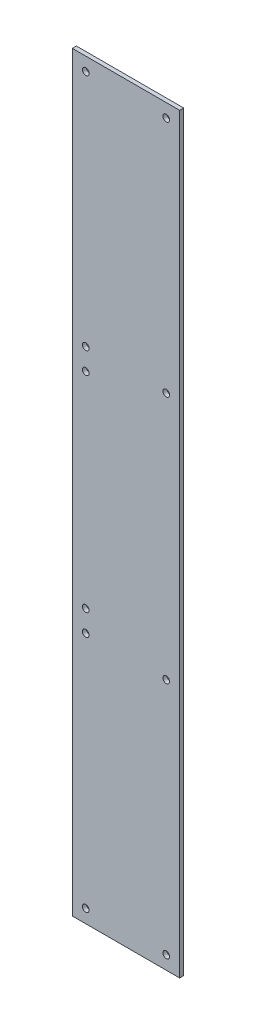
ISO-10303-21;
HEADER;
FILE_DESCRIPTION(('STEP AP214'),'2;1');
FILE_NAME('part.step','',(''),(''),'','','');
FILE_SCHEMA(('AUTOMOTIVE_DESIGN { 1 0 10303 214 1 1 1 1 }'));
ENDSEC;
DATA;
#1=APPLICATION_CONTEXT('core data for automotive mechanical design processes');
#2=APPLICATION_PROTOCOL_DEFINITION('international standard','automotive_design',2000,#1);
#3=PRODUCT_CONTEXT('',#1,'mechanical');
#4=PRODUCT('Part','Part','',(#3));
#5=PRODUCT_RELATED_PRODUCT_CATEGORY('part','',(#4));
#6=PRODUCT_DEFINITION_FORMATION('','',#4);
#7=PRODUCT_DEFINITION_CONTEXT('part definition',#1,'design');
#8=PRODUCT_DEFINITION('design','',#6,#7);
#9=PRODUCT_DEFINITION_SHAPE('','',#8);
#10=(LENGTH_UNIT() NAMED_UNIT(*) SI_UNIT(.MILLI.,.METRE.));
#11=(NAMED_UNIT(*) PLANE_ANGLE_UNIT() SI_UNIT($,.RADIAN.));
#12=(NAMED_UNIT(*) SI_UNIT($,.STERADIAN.) SOLID_ANGLE_UNIT());
#13=UNCERTAINTY_MEASURE_WITH_UNIT(LENGTH_MEASURE(1.E-05),#10,'distance_accuracy_value','');
#14=(GEOMETRIC_REPRESENTATION_CONTEXT(3) GLOBAL_UNCERTAINTY_ASSIGNED_CONTEXT((#13)) GLOBAL_UNIT_ASSIGNED_CONTEXT((#10,
#11,#12)) REPRESENTATION_CONTEXT('',''));
#15=CARTESIAN_POINT('',(0.,0.,0.));
#16=DIRECTION('',(0.,0.,1.));
#17=DIRECTION('',(1.,0.,0.));
#18=AXIS2_PLACEMENT_3D('',#15,#16,#17);
#19=CARTESIAN_POINT('',(-34.3589743589744,84.102564102564,3.));
#20=DIRECTION('',(1.,0.,0.));
#21=DIRECTION('',(0.,1.,0.));
#22=AXIS2_PLACEMENT_3D('',#19,#20,#21);
#23=PLANE('',#22);
#24=DIRECTION('',(0.,-1.,0.));
#25=VECTOR('',#24,1.);
#26=CARTESIAN_POINT('',(-34.3589743589744,84.102564102564,0.));
#27=LINE('',#26,#25);
#28=CARTESIAN_POINT('',(-34.3589743589744,84.102564102564,0.));
#29=VERTEX_POINT('',#28);
#30=CARTESIAN_POINT('',(-34.3589743589743,-475.897435897436,0.));
#31=VERTEX_POINT('',#30);
#32=EDGE_CURVE('E96',#29,#31,#27,.T.);
#33=ORIENTED_EDGE('',*,*,#32,.T.);
#34=DIRECTION('',(0.,0.,-1.));
#35=VECTOR('',#34,1.);
#36=CARTESIAN_POINT('',(-34.3589743589743,-475.897435897436,3.));
#37=LINE('',#36,#35);
#38=CARTESIAN_POINT('',(-34.3589743589743,-475.897435897436,3.));
#39=VERTEX_POINT('',#38);
#40=EDGE_CURVE('E11',#39,#31,#37,.T.);
#41=ORIENTED_EDGE('',*,*,#40,.F.);
#42=DIRECTION('',(0.,-1.,0.));
#43=VECTOR('',#42,1.);
#44=CARTESIAN_POINT('',(-34.3589743589744,84.102564102564,3.));
#45=LINE('',#44,#43);
#46=CARTESIAN_POINT('',(-34.3589743589744,84.102564102564,3.));
#47=VERTEX_POINT('',#46);
#48=EDGE_CURVE('E84',#47,#39,#45,.T.);
#49=ORIENTED_EDGE('',*,*,#48,.F.);
#50=DIRECTION('',(0.,0.,-1.));
#51=VECTOR('',#50,1.);
#52=CARTESIAN_POINT('',(-34.3589743589744,84.102564102564,3.));
#53=LINE('',#52,#51);
#54=EDGE_CURVE('E92',#47,#29,#53,.T.);
#55=ORIENTED_EDGE('',*,*,#54,.T.);
#56=EDGE_LOOP('',(#33,#41,#49,#55));
#57=FACE_BOUND('',#56,.T.);
#58=ADVANCED_FACE('F33',(#57),#23,.F.);
#59=CARTESIAN_POINT('',(-34.3589743589743,-475.897435897436,3.));
#60=DIRECTION('',(0.,1.,0.));
#61=DIRECTION('',(0.,0.,1.));
#62=AXIS2_PLACEMENT_3D('',#59,#60,#61);
#63=PLANE('',#62);
#64=DIRECTION('',(1.,0.,0.));
#65=VECTOR('',#64,1.);
#66=CARTESIAN_POINT('',(-34.3589743589743,-475.897435897436,0.));
#67=LINE('',#66,#65);
#68=CARTESIAN_POINT('',(45.6410256410257,-475.897435897436,0.));
#69=VERTEX_POINT('',#68);
#70=EDGE_CURVE('E88',#31,#69,#67,.T.);
#71=ORIENTED_EDGE('',*,*,#70,.T.);
#72=DIRECTION('',(0.,0.,-1.));
#73=VECTOR('',#72,1.);
#74=CARTESIAN_POINT('',(45.6410256410257,-475.897435897436,3.));
#75=LINE('',#74,#73);
#76=CARTESIAN_POINT('',(45.6410256410257,-475.897435897436,3.));
#77=VERTEX_POINT('',#76);
#78=EDGE_CURVE('E41',#77,#69,#75,.T.);
#79=ORIENTED_EDGE('',*,*,#78,.F.);
#80=DIRECTION('',(1.,0.,0.));
#81=VECTOR('',#80,1.);
#82=CARTESIAN_POINT('',(-34.3589743589743,-475.897435897436,3.));
#83=LINE('',#82,#81);
#84=EDGE_CURVE('E79',#39,#77,#83,.T.);
#85=ORIENTED_EDGE('',*,*,#84,.F.);
#86=ORIENTED_EDGE('',*,*,#40,.T.);
#87=EDGE_LOOP('',(#71,#79,#85,#86));
#88=FACE_BOUND('',#87,.T.);
#89=ADVANCED_FACE('F87',(#88),#63,.F.);
#90=CARTESIAN_POINT('',(45.6410256410256,84.102564102564,3.));
#91=DIRECTION('',(-1.,0.,0.));
#92=DIRECTION('',(0.,-1.,0.));
#93=AXIS2_PLACEMENT_3D('',#90,#91,#92);
#94=PLANE('',#93);
#95=DIRECTION('',(0.,1.,0.));
#96=VECTOR('',#95,1.);
#97=CARTESIAN_POINT('',(45.6410256410256,84.102564102564,0.));
#98=LINE('',#97,#96);
#99=CARTESIAN_POINT('',(45.6410256410256,84.102564102564,0.));
#100=VERTEX_POINT('',#99);
#101=EDGE_CURVE('E66',#69,#100,#98,.T.);
#102=ORIENTED_EDGE('',*,*,#101,.T.);
#103=DIRECTION('',(0.,0.,-1.));
#104=VECTOR('',#103,1.);
#105=CARTESIAN_POINT('',(45.6410256410256,84.102564102564,3.));
#106=LINE('',#105,#104);
#107=CARTESIAN_POINT('',(45.6410256410256,84.102564102564,3.));
#108=VERTEX_POINT('',#107);
#109=EDGE_CURVE('E89',#108,#100,#106,.T.);
#110=ORIENTED_EDGE('',*,*,#109,.F.);
#111=DIRECTION('',(0.,1.,0.));
#112=VECTOR('',#111,1.);
#113=CARTESIAN_POINT('',(45.6410256410256,84.102564102564,3.));
#114=LINE('',#113,#112);
#115=EDGE_CURVE('E82',#77,#108,#114,.T.);
#116=ORIENTED_EDGE('',*,*,#115,.F.);
#117=ORIENTED_EDGE('',*,*,#78,.T.);
#118=EDGE_LOOP('',(#102,#110,#116,#117));
#119=FACE_BOUND('',#118,.T.);
#120=ADVANCED_FACE('F90',(#119),#94,.F.);
#121=CARTESIAN_POINT('',(-34.3589743589744,84.102564102564,3.));
#122=DIRECTION('',(0.,-1.,0.));
#123=DIRECTION('',(0.,0.,-1.));
#124=AXIS2_PLACEMENT_3D('',#121,#122,#123);
#125=PLANE('',#124);
#126=DIRECTION('',(-1.,0.,0.));
#127=VECTOR('',#126,1.);
#128=CARTESIAN_POINT('',(-34.3589743589744,84.102564102564,0.));
#129=LINE('',#128,#127);
#130=EDGE_CURVE('E72',#100,#29,#129,.T.);
#131=ORIENTED_EDGE('',*,*,#130,.T.);
#132=ORIENTED_EDGE('',*,*,#54,.F.);
#133=DIRECTION('',(-1.,0.,0.));
#134=VECTOR('',#133,1.);
#135=CARTESIAN_POINT('',(-34.3589743589744,84.102564102564,3.));
#136=LINE('',#135,#134);
#137=EDGE_CURVE('E49',#108,#47,#136,.T.);
#138=ORIENTED_EDGE('',*,*,#137,.F.);
#139=ORIENTED_EDGE('',*,*,#109,.T.);
#140=EDGE_LOOP('',(#131,#132,#138,#139));
#141=FACE_BOUND('',#140,.T.);
#142=ADVANCED_FACE('F104',(#141),#125,.F.);
#143=CARTESIAN_POINT('',(0.,0.,3.));
#144=DIRECTION('',(0.,0.,1.));
#145=DIRECTION('',(1.,0.,0.));
#146=AXIS2_PLACEMENT_3D('',#143,#144,#145);
#147=PLANE('',#146);
#148=CARTESIAN_POINT('',(-24.3589743589744,-103.397435897436,3.));
#149=DIRECTION('',(0.,0.,1.));
#150=DIRECTION('',(1.,0.,0.));
#151=AXIS2_PLACEMENT_3D('',#148,#149,#150);
#152=CIRCLE('',#151,2.5);
#153=CARTESIAN_POINT('',(-21.8589743589744,-103.397435897436,3.));
#154=VERTEX_POINT('',#153);
#155=EDGE_CURVE('E99',#154,#154,#152,.T.);
#156=ORIENTED_EDGE('',*,*,#155,.F.);
#157=EDGE_LOOP('',(#156));
#158=FACE_BOUND('',#157,.T.);
#159=CARTESIAN_POINT('',(-24.3589743589744,-288.397435897436,3.));
#160=DIRECTION('',(0.,0.,1.));
#161=DIRECTION('',(1.,0.,0.));
#162=AXIS2_PLACEMENT_3D('',#159,#160,#161);
#163=CIRCLE('',#162,2.5);
#164=CARTESIAN_POINT('',(-21.8589743589744,-288.397435897436,3.));
#165=VERTEX_POINT('',#164);
#166=EDGE_CURVE('E112',#165,#165,#163,.T.);
#167=ORIENTED_EDGE('',*,*,#166,.F.);
#168=EDGE_LOOP('',(#167));
#169=FACE_BOUND('',#168,.T.);
#170=CARTESIAN_POINT('',(-24.3589743589744,-272.397435897436,3.));
#171=DIRECTION('',(0.,0.,1.));
#172=DIRECTION('',(1.,0.,0.));
#173=AXIS2_PLACEMENT_3D('',#170,#171,#172);
#174=CIRCLE('',#173,2.5);
#175=CARTESIAN_POINT('',(-21.8589743589744,-272.397435897436,3.));
#176=VERTEX_POINT('',#175);
#177=EDGE_CURVE('E115',#176,#176,#174,.T.);
#178=ORIENTED_EDGE('',*,*,#177,.F.);
#179=EDGE_LOOP('',(#178));
#180=FACE_BOUND('',#179,.T.);
#181=CARTESIAN_POINT('',(-24.3589743589744,-119.397435897436,3.));
#182=DIRECTION('',(0.,0.,1.));
#183=DIRECTION('',(1.,0.,0.));
#184=AXIS2_PLACEMENT_3D('',#181,#182,#183);
#185=CIRCLE('',#184,2.5);
#186=CARTESIAN_POINT('',(-21.8589743589744,-119.397435897436,3.));
#187=VERTEX_POINT('',#186);
#188=EDGE_CURVE('E118',#187,#187,#185,.T.);
#189=ORIENTED_EDGE('',*,*,#188,.F.);
#190=EDGE_LOOP('',(#189));
#191=FACE_BOUND('',#190,.T.);
#192=CARTESIAN_POINT('',(35.6410256410257,74.102564102564,3.));
#193=DIRECTION('',(0.,0.,1.));
#194=DIRECTION('',(1.,0.,0.));
#195=AXIS2_PLACEMENT_3D('',#192,#193,#194);
#196=CIRCLE('',#195,2.5);
#197=CARTESIAN_POINT('',(38.1410256410257,74.102564102564,3.));
#198=VERTEX_POINT('',#197);
#199=EDGE_CURVE('E121',#198,#198,#196,.T.);
#200=ORIENTED_EDGE('',*,*,#199,.F.);
#201=EDGE_LOOP('',(#200));
#202=FACE_BOUND('',#201,.T.);
#203=CARTESIAN_POINT('',(-24.3589743589744,-465.897435897436,3.));
#204=DIRECTION('',(0.,0.,1.));
#205=DIRECTION('',(1.,0.,0.));
#206=AXIS2_PLACEMENT_3D('',#203,#204,#205);
#207=CIRCLE('',#206,2.5);
#208=CARTESIAN_POINT('',(-21.8589743589744,-465.897435897436,3.));
#209=VERTEX_POINT('',#208);
#210=EDGE_CURVE('E124',#209,#209,#207,.T.);
#211=ORIENTED_EDGE('',*,*,#210,.F.);
#212=EDGE_LOOP('',(#211));
#213=FACE_BOUND('',#212,.T.);
#214=CARTESIAN_POINT('',(35.6410256410257,-465.897435897436,3.));
#215=DIRECTION('',(0.,0.,1.));
#216=DIRECTION('',(1.,0.,0.));
#217=AXIS2_PLACEMENT_3D('',#214,#215,#216);
#218=CIRCLE('',#217,2.5);
#219=CARTESIAN_POINT('',(38.1410256410257,-465.897435897436,3.));
#220=VERTEX_POINT('',#219);
#221=EDGE_CURVE('E127',#220,#220,#218,.T.);
#222=ORIENTED_EDGE('',*,*,#221,.F.);
#223=EDGE_LOOP('',(#222));
#224=FACE_BOUND('',#223,.T.);
#225=CARTESIAN_POINT('',(35.6410256410257,-103.397435897436,3.));
#226=DIRECTION('',(0.,0.,1.));
#227=DIRECTION('',(1.,0.,0.));
#228=AXIS2_PLACEMENT_3D('',#225,#226,#227);
#229=CIRCLE('',#228,2.5);
#230=CARTESIAN_POINT('',(38.1410256410257,-103.397435897436,3.));
#231=VERTEX_POINT('',#230);
#232=EDGE_CURVE('E130',#231,#231,#229,.T.);
#233=ORIENTED_EDGE('',*,*,#232,.F.);
#234=EDGE_LOOP('',(#233));
#235=FACE_BOUND('',#234,.T.);
#236=CARTESIAN_POINT('',(35.6410256410257,-288.397435897436,3.));
#237=DIRECTION('',(0.,0.,1.));
#238=DIRECTION('',(1.,0.,0.));
#239=AXIS2_PLACEMENT_3D('',#236,#237,#238);
#240=CIRCLE('',#239,2.5);
#241=CARTESIAN_POINT('',(38.1410256410257,-288.397435897436,3.));
#242=VERTEX_POINT('',#241);
#243=EDGE_CURVE('E133',#242,#242,#240,.T.);
#244=ORIENTED_EDGE('',*,*,#243,.F.);
#245=EDGE_LOOP('',(#244));
#246=FACE_BOUND('',#245,.T.);
#247=CARTESIAN_POINT('',(-24.3589743589744,74.102564102564,3.));
#248=DIRECTION('',(0.,0.,1.));
#249=DIRECTION('',(1.,0.,0.));
#250=AXIS2_PLACEMENT_3D('',#247,#248,#249);
#251=CIRCLE('',#250,2.5);
#252=CARTESIAN_POINT('',(-21.8589743589744,74.102564102564,3.));
#253=VERTEX_POINT('',#252);
#254=EDGE_CURVE('E136',#253,#253,#251,.T.);
#255=ORIENTED_EDGE('',*,*,#254,.F.);
#256=EDGE_LOOP('',(#255));
#257=FACE_BOUND('',#256,.T.);
#258=ORIENTED_EDGE('',*,*,#48,.T.);
#259=ORIENTED_EDGE('',*,*,#84,.T.);
#260=ORIENTED_EDGE('',*,*,#115,.T.);
#261=ORIENTED_EDGE('',*,*,#137,.T.);
#262=EDGE_LOOP('',(#258,#259,#260,#261));
#263=FACE_BOUND('',#262,.T.);
#264=ADVANCED_FACE('F80',(#158,#169,#180,#191,#202,#213,#224,#235,#246,#257,#263),#147,.T.);
#265=CARTESIAN_POINT('',(0.,0.,0.));
#266=DIRECTION('',(0.,0.,1.));
#267=DIRECTION('',(1.,0.,0.));
#268=AXIS2_PLACEMENT_3D('',#265,#266,#267);
#269=PLANE('',#268);
#270=CARTESIAN_POINT('',(-24.3589743589744,-103.397435897436,0.));
#271=DIRECTION('',(0.,0.,1.));
#272=DIRECTION('',(1.,0.,0.));
#273=AXIS2_PLACEMENT_3D('',#270,#271,#272);
#274=CIRCLE('',#273,2.5);
#275=CARTESIAN_POINT('',(-21.8589743589744,-103.397435897436,0.));
#276=VERTEX_POINT('',#275);
#277=EDGE_CURVE('E152',#276,#276,#274,.T.);
#278=ORIENTED_EDGE('',*,*,#277,.T.);
#279=EDGE_LOOP('',(#278));
#280=FACE_BOUND('',#279,.T.);
#281=CARTESIAN_POINT('',(-24.3589743589744,-288.397435897436,0.));
#282=DIRECTION('',(0.,0.,1.));
#283=DIRECTION('',(1.,0.,0.));
#284=AXIS2_PLACEMENT_3D('',#281,#282,#283);
#285=CIRCLE('',#284,2.5);
#286=CARTESIAN_POINT('',(-21.8589743589744,-288.397435897436,0.));
#287=VERTEX_POINT('',#286);
#288=EDGE_CURVE('E155',#287,#287,#285,.T.);
#289=ORIENTED_EDGE('',*,*,#288,.T.);
#290=EDGE_LOOP('',(#289));
#291=FACE_BOUND('',#290,.T.);
#292=CARTESIAN_POINT('',(-24.3589743589744,-272.397435897436,0.));
#293=DIRECTION('',(0.,0.,1.));
#294=DIRECTION('',(1.,0.,0.));
#295=AXIS2_PLACEMENT_3D('',#292,#293,#294);
#296=CIRCLE('',#295,2.5);
#297=CARTESIAN_POINT('',(-21.8589743589744,-272.397435897436,0.));
#298=VERTEX_POINT('',#297);
#299=EDGE_CURVE('E158',#298,#298,#296,.T.);
#300=ORIENTED_EDGE('',*,*,#299,.T.);
#301=EDGE_LOOP('',(#300));
#302=FACE_BOUND('',#301,.T.);
#303=CARTESIAN_POINT('',(-24.3589743589744,-119.397435897436,0.));
#304=DIRECTION('',(0.,0.,1.));
#305=DIRECTION('',(1.,0.,0.));
#306=AXIS2_PLACEMENT_3D('',#303,#304,#305);
#307=CIRCLE('',#306,2.5);
#308=CARTESIAN_POINT('',(-21.8589743589744,-119.397435897436,0.));
#309=VERTEX_POINT('',#308);
#310=EDGE_CURVE('E161',#309,#309,#307,.T.);
#311=ORIENTED_EDGE('',*,*,#310,.T.);
#312=EDGE_LOOP('',(#311));
#313=FACE_BOUND('',#312,.T.);
#314=CARTESIAN_POINT('',(35.6410256410257,74.102564102564,0.));
#315=DIRECTION('',(0.,0.,1.));
#316=DIRECTION('',(1.,0.,0.));
#317=AXIS2_PLACEMENT_3D('',#314,#315,#316);
#318=CIRCLE('',#317,2.5);
#319=CARTESIAN_POINT('',(38.1410256410257,74.102564102564,0.));
#320=VERTEX_POINT('',#319);
#321=EDGE_CURVE('E142',#320,#320,#318,.T.);
#322=ORIENTED_EDGE('',*,*,#321,.T.);
#323=EDGE_LOOP('',(#322));
#324=FACE_BOUND('',#323,.T.);
#325=CARTESIAN_POINT('',(-24.3589743589744,-465.897435897436,0.));
#326=DIRECTION('',(0.,0.,1.));
#327=DIRECTION('',(1.,0.,0.));
#328=AXIS2_PLACEMENT_3D('',#325,#326,#327);
#329=CIRCLE('',#328,2.5);
#330=CARTESIAN_POINT('',(-21.8589743589744,-465.897435897436,0.));
#331=VERTEX_POINT('',#330);
#332=EDGE_CURVE('E143',#331,#331,#329,.T.);
#333=ORIENTED_EDGE('',*,*,#332,.T.);
#334=EDGE_LOOP('',(#333));
#335=FACE_BOUND('',#334,.T.);
#336=CARTESIAN_POINT('',(35.6410256410257,-465.897435897436,0.));
#337=DIRECTION('',(0.,0.,1.));
#338=DIRECTION('',(1.,0.,0.));
#339=AXIS2_PLACEMENT_3D('',#336,#337,#338);
#340=CIRCLE('',#339,2.5);
#341=CARTESIAN_POINT('',(38.1410256410257,-465.897435897436,0.));
#342=VERTEX_POINT('',#341);
#343=EDGE_CURVE('E146',#342,#342,#340,.T.);
#344=ORIENTED_EDGE('',*,*,#343,.T.);
#345=EDGE_LOOP('',(#344));
#346=FACE_BOUND('',#345,.T.);
#347=CARTESIAN_POINT('',(35.6410256410257,-103.397435897436,0.));
#348=DIRECTION('',(0.,0.,1.));
#349=DIRECTION('',(1.,0.,0.));
#350=AXIS2_PLACEMENT_3D('',#347,#348,#349);
#351=CIRCLE('',#350,2.5);
#352=CARTESIAN_POINT('',(38.1410256410257,-103.397435897436,0.));
#353=VERTEX_POINT('',#352);
#354=EDGE_CURVE('E149',#353,#353,#351,.T.);
#355=ORIENTED_EDGE('',*,*,#354,.T.);
#356=EDGE_LOOP('',(#355));
#357=FACE_BOUND('',#356,.T.);
#358=CARTESIAN_POINT('',(35.6410256410257,-288.397435897436,0.));
#359=DIRECTION('',(0.,0.,1.));
#360=DIRECTION('',(1.,0.,0.));
#361=AXIS2_PLACEMENT_3D('',#358,#359,#360);
#362=CIRCLE('',#361,2.5);
#363=CARTESIAN_POINT('',(38.1410256410257,-288.397435897436,0.));
#364=VERTEX_POINT('',#363);
#365=EDGE_CURVE('E164',#364,#364,#362,.T.);
#366=ORIENTED_EDGE('',*,*,#365,.T.);
#367=EDGE_LOOP('',(#366));
#368=FACE_BOUND('',#367,.T.);
#369=CARTESIAN_POINT('',(-24.3589743589744,74.102564102564,0.));
#370=DIRECTION('',(0.,0.,1.));
#371=DIRECTION('',(1.,0.,0.));
#372=AXIS2_PLACEMENT_3D('',#369,#370,#371);
#373=CIRCLE('',#372,2.5);
#374=CARTESIAN_POINT('',(-21.8589743589744,74.102564102564,0.));
#375=VERTEX_POINT('',#374);
#376=EDGE_CURVE('E139',#375,#375,#373,.T.);
#377=ORIENTED_EDGE('',*,*,#376,.T.);
#378=EDGE_LOOP('',(#377));
#379=FACE_BOUND('',#378,.T.);
#380=ORIENTED_EDGE('',*,*,#32,.F.);
#381=ORIENTED_EDGE('',*,*,#130,.F.);
#382=ORIENTED_EDGE('',*,*,#101,.F.);
#383=ORIENTED_EDGE('',*,*,#70,.F.);
#384=EDGE_LOOP('',(#380,#381,#382,#383));
#385=FACE_BOUND('',#384,.T.);
#386=ADVANCED_FACE('F107',(#280,#291,#302,#313,#324,#335,#346,#357,#368,#379,#385),#269,.F.);
#387=CARTESIAN_POINT('',(-24.3589743589744,74.102564102564,0.));
#388=DIRECTION('',(0.,0.,1.));
#389=DIRECTION('',(1.,0.,0.));
#390=AXIS2_PLACEMENT_3D('',#387,#388,#389);
#391=CYLINDRICAL_SURFACE('',#390,2.5);
#392=ORIENTED_EDGE('',*,*,#254,.T.);
#393=EDGE_LOOP('',(#392));
#394=FACE_BOUND('',#393,.T.);
#395=ORIENTED_EDGE('',*,*,#376,.F.);
#396=EDGE_LOOP('',(#395));
#397=FACE_BOUND('',#396,.T.);
#398=ADVANCED_FACE('F175',(#394,#397),#391,.F.);
#399=CARTESIAN_POINT('',(35.6410256410257,-288.397435897436,0.));
#400=DIRECTION('',(0.,0.,1.));
#401=DIRECTION('',(1.,0.,0.));
#402=AXIS2_PLACEMENT_3D('',#399,#400,#401);
#403=CYLINDRICAL_SURFACE('',#402,2.5);
#404=ORIENTED_EDGE('',*,*,#243,.T.);
#405=EDGE_LOOP('',(#404));
#406=FACE_BOUND('',#405,.T.);
#407=ORIENTED_EDGE('',*,*,#365,.F.);
#408=EDGE_LOOP('',(#407));
#409=FACE_BOUND('',#408,.T.);
#410=ADVANCED_FACE('F172',(#406,#409),#403,.F.);
#411=CARTESIAN_POINT('',(35.6410256410257,-103.397435897436,0.));
#412=DIRECTION('',(0.,0.,1.));
#413=DIRECTION('',(1.,0.,0.));
#414=AXIS2_PLACEMENT_3D('',#411,#412,#413);
#415=CYLINDRICAL_SURFACE('',#414,2.5);
#416=ORIENTED_EDGE('',*,*,#232,.T.);
#417=EDGE_LOOP('',(#416));
#418=FACE_BOUND('',#417,.T.);
#419=ORIENTED_EDGE('',*,*,#354,.F.);
#420=EDGE_LOOP('',(#419));
#421=FACE_BOUND('',#420,.T.);
#422=ADVANCED_FACE('F174',(#418,#421),#415,.F.);
#423=CARTESIAN_POINT('',(35.6410256410257,-465.897435897436,0.));
#424=DIRECTION('',(0.,0.,1.));
#425=DIRECTION('',(1.,0.,0.));
#426=AXIS2_PLACEMENT_3D('',#423,#424,#425);
#427=CYLINDRICAL_SURFACE('',#426,2.5);
#428=ORIENTED_EDGE('',*,*,#221,.T.);
#429=EDGE_LOOP('',(#428));
#430=FACE_BOUND('',#429,.T.);
#431=ORIENTED_EDGE('',*,*,#343,.F.);
#432=EDGE_LOOP('',(#431));
#433=FACE_BOUND('',#432,.T.);
#434=ADVANCED_FACE('F182',(#430,#433),#427,.F.);
#435=CARTESIAN_POINT('',(-24.3589743589744,-465.897435897436,0.));
#436=DIRECTION('',(0.,0.,1.));
#437=DIRECTION('',(1.,0.,0.));
#438=AXIS2_PLACEMENT_3D('',#435,#436,#437);
#439=CYLINDRICAL_SURFACE('',#438,2.5);
#440=ORIENTED_EDGE('',*,*,#210,.T.);
#441=EDGE_LOOP('',(#440));
#442=FACE_BOUND('',#441,.T.);
#443=ORIENTED_EDGE('',*,*,#332,.F.);
#444=EDGE_LOOP('',(#443));
#445=FACE_BOUND('',#444,.T.);
#446=ADVANCED_FACE('F205',(#442,#445),#439,.F.);
#447=CARTESIAN_POINT('',(35.6410256410257,74.102564102564,0.));
#448=DIRECTION('',(0.,0.,1.));
#449=DIRECTION('',(1.,0.,0.));
#450=AXIS2_PLACEMENT_3D('',#447,#448,#449);
#451=CYLINDRICAL_SURFACE('',#450,2.5);
#452=ORIENTED_EDGE('',*,*,#199,.T.);
#453=EDGE_LOOP('',(#452));
#454=FACE_BOUND('',#453,.T.);
#455=ORIENTED_EDGE('',*,*,#321,.F.);
#456=EDGE_LOOP('',(#455));
#457=FACE_BOUND('',#456,.T.);
#458=ADVANCED_FACE('F208',(#454,#457),#451,.F.);
#459=CARTESIAN_POINT('',(-24.3589743589744,-119.397435897436,0.));
#460=DIRECTION('',(0.,0.,1.));
#461=DIRECTION('',(1.,0.,0.));
#462=AXIS2_PLACEMENT_3D('',#459,#460,#461);
#463=CYLINDRICAL_SURFACE('',#462,2.5);
#464=ORIENTED_EDGE('',*,*,#188,.T.);
#465=EDGE_LOOP('',(#464));
#466=FACE_BOUND('',#465,.T.);
#467=ORIENTED_EDGE('',*,*,#310,.F.);
#468=EDGE_LOOP('',(#467));
#469=FACE_BOUND('',#468,.T.);
#470=ADVANCED_FACE('F211',(#466,#469),#463,.F.);
#471=CARTESIAN_POINT('',(-24.3589743589744,-272.397435897436,0.));
#472=DIRECTION('',(0.,0.,1.));
#473=DIRECTION('',(1.,0.,0.));
#474=AXIS2_PLACEMENT_3D('',#471,#472,#473);
#475=CYLINDRICAL_SURFACE('',#474,2.5);
#476=ORIENTED_EDGE('',*,*,#177,.T.);
#477=EDGE_LOOP('',(#476));
#478=FACE_BOUND('',#477,.T.);
#479=ORIENTED_EDGE('',*,*,#299,.F.);
#480=EDGE_LOOP('',(#479));
#481=FACE_BOUND('',#480,.T.);
#482=ADVANCED_FACE('F221',(#478,#481),#475,.F.);
#483=CARTESIAN_POINT('',(-24.3589743589744,-288.397435897436,0.));
#484=DIRECTION('',(0.,0.,1.));
#485=DIRECTION('',(1.,0.,0.));
#486=AXIS2_PLACEMENT_3D('',#483,#484,#485);
#487=CYLINDRICAL_SURFACE('',#486,2.5);
#488=ORIENTED_EDGE('',*,*,#166,.T.);
#489=EDGE_LOOP('',(#488));
#490=FACE_BOUND('',#489,.T.);
#491=ORIENTED_EDGE('',*,*,#288,.F.);
#492=EDGE_LOOP('',(#491));
#493=FACE_BOUND('',#492,.T.);
#494=ADVANCED_FACE('F217',(#490,#493),#487,.F.);
#495=CARTESIAN_POINT('',(-24.3589743589744,-103.397435897436,0.));
#496=DIRECTION('',(0.,0.,1.));
#497=DIRECTION('',(1.,0.,0.));
#498=AXIS2_PLACEMENT_3D('',#495,#496,#497);
#499=CYLINDRICAL_SURFACE('',#498,2.5);
#500=ORIENTED_EDGE('',*,*,#155,.T.);
#501=EDGE_LOOP('',(#500));
#502=FACE_BOUND('',#501,.T.);
#503=ORIENTED_EDGE('',*,*,#277,.F.);
#504=EDGE_LOOP('',(#503));
#505=FACE_BOUND('',#504,.T.);
#506=ADVANCED_FACE('F220',(#502,#505),#499,.F.);
#507=CLOSED_SHELL('',(#58,#89,#120,#142,#264,#386,#398,#410,#422,#434,#446,#458,#470,#482,#494,#506));
#508=MANIFOLD_SOLID_BREP('B2',#507);
#509=ADVANCED_BREP_SHAPE_REPRESENTATION('',(#18,#508),#14);
#510=SHAPE_DEFINITION_REPRESENTATION(#9,#509);
ENDSEC;
END-ISO-10303-21;
